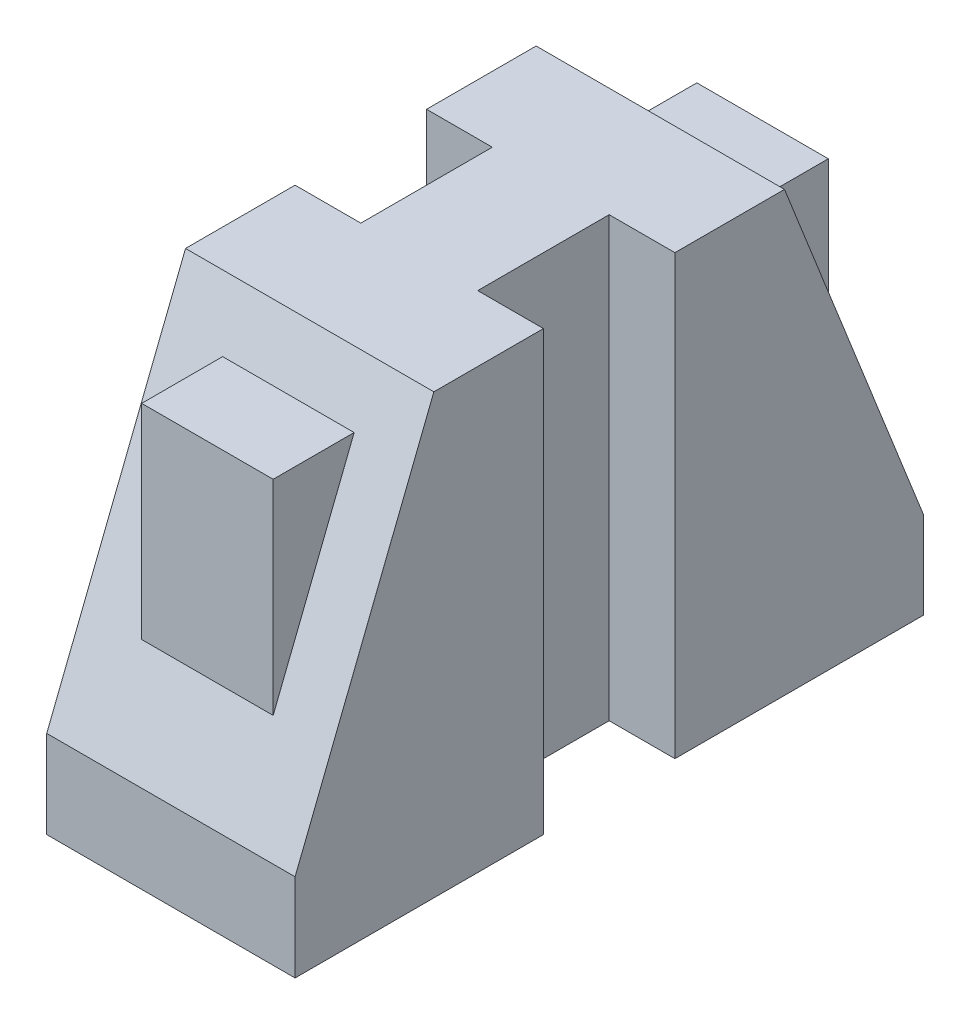
ISO-10303-21;
HEADER;
FILE_DESCRIPTION(('STEP AP214'),'2;1');
FILE_NAME('part.step','',(''),(''),'','','');
FILE_SCHEMA(('AUTOMOTIVE_DESIGN { 1 0 10303 214 1 1 1 1 }'));
ENDSEC;
DATA;
#1=APPLICATION_CONTEXT('core data for automotive mechanical design processes');
#2=APPLICATION_PROTOCOL_DEFINITION('international standard','automotive_design',2000,#1);
#3=PRODUCT_CONTEXT('',#1,'mechanical');
#4=PRODUCT('Part','Part','',(#3));
#5=PRODUCT_RELATED_PRODUCT_CATEGORY('part','',(#4));
#6=PRODUCT_DEFINITION_FORMATION('','',#4);
#7=PRODUCT_DEFINITION_CONTEXT('part definition',#1,'design');
#8=PRODUCT_DEFINITION('design','',#6,#7);
#9=PRODUCT_DEFINITION_SHAPE('','',#8);
#10=(LENGTH_UNIT() NAMED_UNIT(*) SI_UNIT(.MILLI.,.METRE.));
#11=(NAMED_UNIT(*) PLANE_ANGLE_UNIT() SI_UNIT($,.RADIAN.));
#12=(NAMED_UNIT(*) SI_UNIT($,.STERADIAN.) SOLID_ANGLE_UNIT());
#13=UNCERTAINTY_MEASURE_WITH_UNIT(LENGTH_MEASURE(1.E-05),#10,'distance_accuracy_value','');
#14=(GEOMETRIC_REPRESENTATION_CONTEXT(3) GLOBAL_UNCERTAINTY_ASSIGNED_CONTEXT((#13)) GLOBAL_UNIT_ASSIGNED_CONTEXT((#10,
#11,#12)) REPRESENTATION_CONTEXT('',''));
#15=CARTESIAN_POINT('',(0.,0.,0.));
#16=DIRECTION('',(0.,0.,1.));
#17=DIRECTION('',(1.,0.,0.));
#18=AXIS2_PLACEMENT_3D('',#15,#16,#17);
#19=CARTESIAN_POINT('',(17.,0.,0.));
#20=DIRECTION('',(-1.,0.,0.));
#21=DIRECTION('',(0.,0.,1.));
#22=AXIS2_PLACEMENT_3D('',#19,#20,#21);
#23=PLANE('',#22);
#24=DIRECTION('',(0.,0.,-1.));
#25=VECTOR('',#24,1.);
#26=CARTESIAN_POINT('',(17.,0.,-43.));
#27=LINE('',#26,#25);
#28=CARTESIAN_POINT('',(17.,0.,43.));
#29=VERTEX_POINT('',#28);
#30=CARTESIAN_POINT('',(17.,0.,9.));
#31=VERTEX_POINT('',#30);
#32=EDGE_CURVE('E293',#29,#31,#27,.T.);
#33=ORIENTED_EDGE('',*,*,#32,.T.);
#34=DIRECTION('',(0.,1.,0.));
#35=VECTOR('',#34,1.);
#36=CARTESIAN_POINT('',(17.,0.,9.));
#37=LINE('',#36,#35);
#38=CARTESIAN_POINT('',(17.,60.,9.));
#39=VERTEX_POINT('',#38);
#40=EDGE_CURVE('E247',#31,#39,#37,.T.);
#41=ORIENTED_EDGE('',*,*,#40,.T.);
#42=DIRECTION('',(0.,0.,1.));
#43=VECTOR('',#42,1.);
#44=CARTESIAN_POINT('',(17.,60.,24.));
#45=LINE('',#44,#43);
#46=CARTESIAN_POINT('',(17.,60.,24.));
#47=VERTEX_POINT('',#46);
#48=EDGE_CURVE('E283',#39,#47,#45,.T.);
#49=ORIENTED_EDGE('',*,*,#48,.T.);
#50=DIRECTION('',(0.,-0.929806613071272,0.368048451007378));
#51=VECTOR('',#50,1.);
#52=CARTESIAN_POINT('',(17.,12.,43.));
#53=LINE('',#52,#51);
#54=CARTESIAN_POINT('',(17.,12.,43.));
#55=VERTEX_POINT('',#54);
#56=EDGE_CURVE('E288',#47,#55,#53,.T.);
#57=ORIENTED_EDGE('',*,*,#56,.T.);
#58=DIRECTION('',(0.,-1.,0.));
#59=VECTOR('',#58,1.);
#60=CARTESIAN_POINT('',(17.,0.,43.));
#61=LINE('',#60,#59);
#62=EDGE_CURVE('E290',#55,#29,#61,.T.);
#63=ORIENTED_EDGE('',*,*,#62,.T.);
#64=EDGE_LOOP('',(#33,#41,#49,#57,#63));
#65=FACE_BOUND('',#64,.T.);
#66=ADVANCED_FACE('F39',(#65),#23,.F.);
#67=CARTESIAN_POINT('',(-17.,0.,0.));
#68=DIRECTION('',(-1.,0.,0.));
#69=DIRECTION('',(0.,0.,1.));
#70=AXIS2_PLACEMENT_3D('',#67,#68,#69);
#71=PLANE('',#70);
#72=DIRECTION('',(0.,1.,0.));
#73=VECTOR('',#72,1.);
#74=CARTESIAN_POINT('',(-17.,0.,-9.));
#75=LINE('',#74,#73);
#76=CARTESIAN_POINT('',(-17.,0.,-9.));
#77=VERTEX_POINT('',#76);
#78=CARTESIAN_POINT('',(-17.,60.,-9.));
#79=VERTEX_POINT('',#78);
#80=EDGE_CURVE('E243',#77,#79,#75,.T.);
#81=ORIENTED_EDGE('',*,*,#80,.T.);
#82=DIRECTION('',(0.,0.,1.));
#83=VECTOR('',#82,1.);
#84=CARTESIAN_POINT('',(-17.,60.,24.));
#85=LINE('',#84,#83);
#86=CARTESIAN_POINT('',(-17.,60.,-24.));
#87=VERTEX_POINT('',#86);
#88=EDGE_CURVE('E302',#87,#79,#85,.T.);
#89=ORIENTED_EDGE('',*,*,#88,.F.);
#90=DIRECTION('',(0.,0.929806613071272,0.368048451007378));
#91=VECTOR('',#90,1.);
#92=CARTESIAN_POINT('',(-17.,12.,-43.));
#93=LINE('',#92,#91);
#94=CARTESIAN_POINT('',(-17.,12.,-43.));
#95=VERTEX_POINT('',#94);
#96=EDGE_CURVE('E250',#95,#87,#93,.T.);
#97=ORIENTED_EDGE('',*,*,#96,.F.);
#98=DIRECTION('',(0.,1.,0.));
#99=VECTOR('',#98,1.);
#100=CARTESIAN_POINT('',(-17.,0.,-43.));
#101=LINE('',#100,#99);
#102=CARTESIAN_POINT('',(-17.,0.,-43.));
#103=VERTEX_POINT('',#102);
#104=EDGE_CURVE('E284',#103,#95,#101,.T.);
#105=ORIENTED_EDGE('',*,*,#104,.F.);
#106=DIRECTION('',(0.,0.,-1.));
#107=VECTOR('',#106,1.);
#108=CARTESIAN_POINT('',(-17.,0.,-43.));
#109=LINE('',#108,#107);
#110=EDGE_CURVE('E309',#77,#103,#109,.T.);
#111=ORIENTED_EDGE('',*,*,#110,.F.);
#112=EDGE_LOOP('',(#81,#89,#97,#105,#111));
#113=FACE_BOUND('',#112,.T.);
#114=ADVANCED_FACE('F371',(#113),#71,.T.);
#115=CARTESIAN_POINT('',(17.,12.,-43.));
#116=DIRECTION('',(0.,-0.368048451007378,0.929806613071272));
#117=DIRECTION('',(0.,-0.929806613071272,-0.368048451007378));
#118=AXIS2_PLACEMENT_3D('',#115,#116,#117);
#119=PLANE('',#118);
#120=DIRECTION('',(-1.,0.,0.));
#121=VECTOR('',#120,1.);
#122=CARTESIAN_POINT('',(9.,52.6315789473684,-26.9166666666667));
#123=LINE('',#122,#121);
#124=CARTESIAN_POINT('',(9.,52.6315789473684,-26.9166666666667));
#125=VERTEX_POINT('',#124);
#126=CARTESIAN_POINT('',(-9.,52.6315789473684,-26.9166666666667));
#127=VERTEX_POINT('',#126);
#128=EDGE_CURVE('E188',#125,#127,#123,.T.);
#129=ORIENTED_EDGE('',*,*,#128,.T.);
#130=DIRECTION('',(0.,-0.929806613071272,-0.368048451007378));
#131=VECTOR('',#130,1.);
#132=CARTESIAN_POINT('',(-9.,52.6315789473684,-26.9166666666667));
#133=LINE('',#132,#131);
#134=CARTESIAN_POINT('',(-9.,24.6315789473684,-38.));
#135=VERTEX_POINT('',#134);
#136=EDGE_CURVE('E201',#127,#135,#133,.T.);
#137=ORIENTED_EDGE('',*,*,#136,.T.);
#138=DIRECTION('',(-1.,0.,0.));
#139=VECTOR('',#138,1.);
#140=CARTESIAN_POINT('',(9.,24.6315789473684,-38.));
#141=LINE('',#140,#139);
#142=CARTESIAN_POINT('',(9.,24.6315789473684,-38.));
#143=VERTEX_POINT('',#142);
#144=EDGE_CURVE('E192',#143,#135,#141,.T.);
#145=ORIENTED_EDGE('',*,*,#144,.F.);
#146=DIRECTION('',(0.,-0.929806613071272,-0.368048451007378));
#147=VECTOR('',#146,1.);
#148=CARTESIAN_POINT('',(9.,52.6315789473684,-26.9166666666667));
#149=LINE('',#148,#147);
#150=EDGE_CURVE('E181',#125,#143,#149,.T.);
#151=ORIENTED_EDGE('',*,*,#150,.F.);
#152=EDGE_LOOP('',(#129,#137,#145,#151));
#153=FACE_BOUND('',#152,.T.);
#154=ORIENTED_EDGE('',*,*,#96,.T.);
#155=DIRECTION('',(-1.,0.,0.));
#156=VECTOR('',#155,1.);
#157=CARTESIAN_POINT('',(17.,60.,-24.));
#158=LINE('',#157,#156);
#159=CARTESIAN_POINT('',(17.,60.,-24.));
#160=VERTEX_POINT('',#159);
#161=EDGE_CURVE('E11',#160,#87,#158,.T.);
#162=ORIENTED_EDGE('',*,*,#161,.F.);
#163=DIRECTION('',(0.,0.929806613071272,0.368048451007378));
#164=VECTOR('',#163,1.);
#165=CARTESIAN_POINT('',(17.,12.,-43.));
#166=LINE('',#165,#164);
#167=CARTESIAN_POINT('',(17.,12.,-43.));
#168=VERTEX_POINT('',#167);
#169=EDGE_CURVE('E280',#168,#160,#166,.T.);
#170=ORIENTED_EDGE('',*,*,#169,.F.);
#171=DIRECTION('',(-1.,0.,0.));
#172=VECTOR('',#171,1.);
#173=CARTESIAN_POINT('',(17.,12.,-43.));
#174=LINE('',#173,#172);
#175=EDGE_CURVE('E298',#168,#95,#174,.T.);
#176=ORIENTED_EDGE('',*,*,#175,.T.);
#177=EDGE_LOOP('',(#154,#162,#170,#176));
#178=FACE_BOUND('',#177,.T.);
#179=ADVANCED_FACE('F41',(#153,#178),#119,.F.);
#180=CARTESIAN_POINT('',(17.,60.,24.));
#181=DIRECTION('',(0.,-1.,0.));
#182=DIRECTION('',(0.,0.,-1.));
#183=AXIS2_PLACEMENT_3D('',#180,#181,#182);
#184=PLANE('',#183);
#185=ORIENTED_EDGE('',*,*,#48,.F.);
#186=DIRECTION('',(1.,0.,0.));
#187=VECTOR('',#186,1.);
#188=CARTESIAN_POINT('',(17.,60.,9.));
#189=LINE('',#188,#187);
#190=CARTESIAN_POINT('',(8.,60.,9.));
#191=VERTEX_POINT('',#190);
#192=EDGE_CURVE('E232',#191,#39,#189,.T.);
#193=ORIENTED_EDGE('',*,*,#192,.F.);
#194=DIRECTION('',(0.,0.,1.));
#195=VECTOR('',#194,1.);
#196=CARTESIAN_POINT('',(8.,60.,-9.));
#197=LINE('',#196,#195);
#198=CARTESIAN_POINT('',(8.,60.,-9.));
#199=VERTEX_POINT('',#198);
#200=EDGE_CURVE('E242',#199,#191,#197,.T.);
#201=ORIENTED_EDGE('',*,*,#200,.F.);
#202=DIRECTION('',(-1.,0.,0.));
#203=VECTOR('',#202,1.);
#204=CARTESIAN_POINT('',(17.,60.,-9.));
#205=LINE('',#204,#203);
#206=CARTESIAN_POINT('',(17.,60.,-9.));
#207=VERTEX_POINT('',#206);
#208=EDGE_CURVE('E239',#207,#199,#205,.T.);
#209=ORIENTED_EDGE('',*,*,#208,.F.);
#210=EDGE_CURVE('E285',#160,#207,#45,.T.);
#211=ORIENTED_EDGE('',*,*,#210,.F.);
#212=ORIENTED_EDGE('',*,*,#161,.T.);
#213=ORIENTED_EDGE('',*,*,#88,.T.);
#214=DIRECTION('',(-1.,0.,0.));
#215=VECTOR('',#214,1.);
#216=CARTESIAN_POINT('',(-17.,60.,-9.));
#217=LINE('',#216,#215);
#218=CARTESIAN_POINT('',(-8.,60.,-9.));
#219=VERTEX_POINT('',#218);
#220=EDGE_CURVE('E260',#219,#79,#217,.T.);
#221=ORIENTED_EDGE('',*,*,#220,.F.);
#222=DIRECTION('',(0.,0.,-1.));
#223=VECTOR('',#222,1.);
#224=CARTESIAN_POINT('',(-8.,60.,-9.));
#225=LINE('',#224,#223);
#226=CARTESIAN_POINT('',(-8.,60.,9.));
#227=VERTEX_POINT('',#226);
#228=EDGE_CURVE('E269',#227,#219,#225,.T.);
#229=ORIENTED_EDGE('',*,*,#228,.F.);
#230=DIRECTION('',(1.,0.,0.));
#231=VECTOR('',#230,1.);
#232=CARTESIAN_POINT('',(-17.,60.,9.));
#233=LINE('',#232,#231);
#234=CARTESIAN_POINT('',(-17.,60.,9.));
#235=VERTEX_POINT('',#234);
#236=EDGE_CURVE('E227',#235,#227,#233,.T.);
#237=ORIENTED_EDGE('',*,*,#236,.F.);
#238=CARTESIAN_POINT('',(-17.,60.,24.));
#239=VERTEX_POINT('',#238);
#240=EDGE_CURVE('E301',#235,#239,#85,.T.);
#241=ORIENTED_EDGE('',*,*,#240,.T.);
#242=DIRECTION('',(-1.,0.,0.));
#243=VECTOR('',#242,1.);
#244=CARTESIAN_POINT('',(17.,60.,24.));
#245=LINE('',#244,#243);
#246=EDGE_CURVE('E47',#47,#239,#245,.T.);
#247=ORIENTED_EDGE('',*,*,#246,.F.);
#248=EDGE_LOOP('',(#185,#193,#201,#209,#211,#212,#213,#221,#229,#237,#241,#247));
#249=FACE_BOUND('',#248,.T.);
#250=ADVANCED_FACE('F349',(#249),#184,.F.);
#251=CARTESIAN_POINT('',(17.,12.,43.));
#252=DIRECTION('',(0.,-0.368048451007378,-0.929806613071272));
#253=DIRECTION('',(0.,0.929806613071272,-0.368048451007378));
#254=AXIS2_PLACEMENT_3D('',#251,#252,#253);
#255=PLANE('',#254);
#256=DIRECTION('',(-1.,0.,0.));
#257=VECTOR('',#256,1.);
#258=CARTESIAN_POINT('',(9.,24.6315789473684,38.));
#259=LINE('',#258,#257);
#260=CARTESIAN_POINT('',(9.,24.6315789473684,38.));
#261=VERTEX_POINT('',#260);
#262=CARTESIAN_POINT('',(-9.,24.6315789473684,38.));
#263=VERTEX_POINT('',#262);
#264=EDGE_CURVE('E214',#261,#263,#259,.T.);
#265=ORIENTED_EDGE('',*,*,#264,.T.);
#266=DIRECTION('',(0.,0.929806613071272,-0.368048451007378));
#267=VECTOR('',#266,1.);
#268=CARTESIAN_POINT('',(-9.,52.6315789473684,26.9166666666667));
#269=LINE('',#268,#267);
#270=CARTESIAN_POINT('',(-9.,52.6315789473684,26.9166666666667));
#271=VERTEX_POINT('',#270);
#272=EDGE_CURVE('E62',#263,#271,#269,.T.);
#273=ORIENTED_EDGE('',*,*,#272,.T.);
#274=DIRECTION('',(-1.,0.,0.));
#275=VECTOR('',#274,1.);
#276=CARTESIAN_POINT('',(9.,52.6315789473684,26.9166666666667));
#277=LINE('',#276,#275);
#278=CARTESIAN_POINT('',(9.,52.6315789473684,26.9166666666667));
#279=VERTEX_POINT('',#278);
#280=EDGE_CURVE('E224',#279,#271,#277,.T.);
#281=ORIENTED_EDGE('',*,*,#280,.F.);
#282=DIRECTION('',(0.,0.929806613071272,-0.368048451007378));
#283=VECTOR('',#282,1.);
#284=CARTESIAN_POINT('',(9.,52.6315789473684,26.9166666666667));
#285=LINE('',#284,#283);
#286=EDGE_CURVE('E206',#261,#279,#285,.T.);
#287=ORIENTED_EDGE('',*,*,#286,.F.);
#288=EDGE_LOOP('',(#265,#273,#281,#287));
#289=FACE_BOUND('',#288,.T.);
#290=DIRECTION('',(0.,-0.929806613071272,0.368048451007378));
#291=VECTOR('',#290,1.);
#292=CARTESIAN_POINT('',(-17.,12.,43.));
#293=LINE('',#292,#291);
#294=CARTESIAN_POINT('',(-17.,12.,43.));
#295=VERTEX_POINT('',#294);
#296=EDGE_CURVE('E305',#239,#295,#293,.T.);
#297=ORIENTED_EDGE('',*,*,#296,.T.);
#298=DIRECTION('',(-1.,0.,0.));
#299=VECTOR('',#298,1.);
#300=CARTESIAN_POINT('',(17.,12.,43.));
#301=LINE('',#300,#299);
#302=EDGE_CURVE('E322',#55,#295,#301,.T.);
#303=ORIENTED_EDGE('',*,*,#302,.F.);
#304=ORIENTED_EDGE('',*,*,#56,.F.);
#305=ORIENTED_EDGE('',*,*,#246,.T.);
#306=EDGE_LOOP('',(#297,#303,#304,#305));
#307=FACE_BOUND('',#306,.T.);
#308=ADVANCED_FACE('F329',(#289,#307),#255,.F.);
#309=CARTESIAN_POINT('',(17.,0.,43.));
#310=DIRECTION('',(0.,0.,-1.));
#311=DIRECTION('',(-1.,0.,0.));
#312=AXIS2_PLACEMENT_3D('',#309,#310,#311);
#313=PLANE('',#312);
#314=DIRECTION('',(0.,-1.,0.));
#315=VECTOR('',#314,1.);
#316=CARTESIAN_POINT('',(-17.,0.,43.));
#317=LINE('',#316,#315);
#318=CARTESIAN_POINT('',(-17.,0.,43.));
#319=VERTEX_POINT('',#318);
#320=EDGE_CURVE('E307',#295,#319,#317,.T.);
#321=ORIENTED_EDGE('',*,*,#320,.T.);
#322=DIRECTION('',(-1.,0.,0.));
#323=VECTOR('',#322,1.);
#324=CARTESIAN_POINT('',(17.,0.,43.));
#325=LINE('',#324,#323);
#326=EDGE_CURVE('E319',#29,#319,#325,.T.);
#327=ORIENTED_EDGE('',*,*,#326,.F.);
#328=ORIENTED_EDGE('',*,*,#62,.F.);
#329=ORIENTED_EDGE('',*,*,#302,.T.);
#330=EDGE_LOOP('',(#321,#327,#328,#329));
#331=FACE_BOUND('',#330,.T.);
#332=ADVANCED_FACE('F341',(#331),#313,.F.);
#333=CARTESIAN_POINT('',(17.,0.,-43.));
#334=DIRECTION('',(0.,1.,0.));
#335=DIRECTION('',(0.,0.,1.));
#336=AXIS2_PLACEMENT_3D('',#333,#334,#335);
#337=PLANE('',#336);
#338=DIRECTION('',(0.,0.,1.));
#339=VECTOR('',#338,1.);
#340=CARTESIAN_POINT('',(8.,0.,-9.));
#341=LINE('',#340,#339);
#342=CARTESIAN_POINT('',(8.,0.,-9.));
#343=VERTEX_POINT('',#342);
#344=CARTESIAN_POINT('',(8.,0.,9.));
#345=VERTEX_POINT('',#344);
#346=EDGE_CURVE('E231',#343,#345,#341,.T.);
#347=ORIENTED_EDGE('',*,*,#346,.T.);
#348=DIRECTION('',(1.,0.,0.));
#349=VECTOR('',#348,1.);
#350=CARTESIAN_POINT('',(17.,0.,9.));
#351=LINE('',#350,#349);
#352=EDGE_CURVE('E235',#345,#31,#351,.T.);
#353=ORIENTED_EDGE('',*,*,#352,.T.);
#354=ORIENTED_EDGE('',*,*,#32,.F.);
#355=ORIENTED_EDGE('',*,*,#326,.T.);
#356=CARTESIAN_POINT('',(-17.,0.,9.));
#357=VERTEX_POINT('',#356);
#358=EDGE_CURVE('E310',#319,#357,#109,.T.);
#359=ORIENTED_EDGE('',*,*,#358,.T.);
#360=DIRECTION('',(1.,0.,0.));
#361=VECTOR('',#360,1.);
#362=CARTESIAN_POINT('',(-17.,0.,9.));
#363=LINE('',#362,#361);
#364=CARTESIAN_POINT('',(-8.,0.,9.));
#365=VERTEX_POINT('',#364);
#366=EDGE_CURVE('E256',#357,#365,#363,.T.);
#367=ORIENTED_EDGE('',*,*,#366,.T.);
#368=DIRECTION('',(0.,0.,-1.));
#369=VECTOR('',#368,1.);
#370=CARTESIAN_POINT('',(-8.,0.,-9.));
#371=LINE('',#370,#369);
#372=CARTESIAN_POINT('',(-8.,0.,-9.));
#373=VERTEX_POINT('',#372);
#374=EDGE_CURVE('E259',#365,#373,#371,.T.);
#375=ORIENTED_EDGE('',*,*,#374,.T.);
#376=DIRECTION('',(-1.,0.,0.));
#377=VECTOR('',#376,1.);
#378=CARTESIAN_POINT('',(-17.,0.,-9.));
#379=LINE('',#378,#377);
#380=EDGE_CURVE('E263',#373,#77,#379,.T.);
#381=ORIENTED_EDGE('',*,*,#380,.T.);
#382=ORIENTED_EDGE('',*,*,#110,.T.);
#383=DIRECTION('',(-1.,0.,0.));
#384=VECTOR('',#383,1.);
#385=CARTESIAN_POINT('',(17.,0.,-43.));
#386=LINE('',#385,#384);
#387=CARTESIAN_POINT('',(17.,0.,-43.));
#388=VERTEX_POINT('',#387);
#389=EDGE_CURVE('E316',#388,#103,#386,.T.);
#390=ORIENTED_EDGE('',*,*,#389,.F.);
#391=CARTESIAN_POINT('',(17.,0.,-9.));
#392=VERTEX_POINT('',#391);
#393=EDGE_CURVE('E292',#392,#388,#27,.T.);
#394=ORIENTED_EDGE('',*,*,#393,.F.);
#395=DIRECTION('',(-1.,0.,0.));
#396=VECTOR('',#395,1.);
#397=CARTESIAN_POINT('',(17.,0.,-9.));
#398=LINE('',#397,#396);
#399=EDGE_CURVE('E228',#392,#343,#398,.T.);
#400=ORIENTED_EDGE('',*,*,#399,.T.);
#401=EDGE_LOOP('',(#347,#353,#354,#355,#359,#367,#375,#381,#382,#390,#394,#400));
#402=FACE_BOUND('',#401,.T.);
#403=ADVANCED_FACE('F345',(#402),#337,.F.);
#404=CARTESIAN_POINT('',(17.,0.,-43.));
#405=DIRECTION('',(0.,0.,1.));
#406=DIRECTION('',(1.,0.,0.));
#407=AXIS2_PLACEMENT_3D('',#404,#405,#406);
#408=PLANE('',#407);
#409=ORIENTED_EDGE('',*,*,#104,.T.);
#410=ORIENTED_EDGE('',*,*,#175,.F.);
#411=DIRECTION('',(0.,1.,0.));
#412=VECTOR('',#411,1.);
#413=CARTESIAN_POINT('',(17.,0.,-43.));
#414=LINE('',#413,#412);
#415=EDGE_CURVE('E296',#388,#168,#414,.T.);
#416=ORIENTED_EDGE('',*,*,#415,.F.);
#417=ORIENTED_EDGE('',*,*,#389,.T.);
#418=EDGE_LOOP('',(#409,#410,#416,#417));
#419=FACE_BOUND('',#418,.T.);
#420=ADVANCED_FACE('F400',(#419),#408,.F.);
#421=ORIENTED_EDGE('',*,*,#210,.T.);
#422=DIRECTION('',(0.,1.,0.));
#423=VECTOR('',#422,1.);
#424=CARTESIAN_POINT('',(17.,0.,-9.));
#425=LINE('',#424,#423);
#426=EDGE_CURVE('E238',#392,#207,#425,.T.);
#427=ORIENTED_EDGE('',*,*,#426,.F.);
#428=ORIENTED_EDGE('',*,*,#393,.T.);
#429=ORIENTED_EDGE('',*,*,#415,.T.);
#430=ORIENTED_EDGE('',*,*,#169,.T.);
#431=EDGE_LOOP('',(#421,#427,#428,#429,#430));
#432=FACE_BOUND('',#431,.T.);
#433=ADVANCED_FACE('F361',(#432),#23,.F.);
#434=DIRECTION('',(0.,1.,0.));
#435=VECTOR('',#434,1.);
#436=CARTESIAN_POINT('',(-17.,0.,9.));
#437=LINE('',#436,#435);
#438=EDGE_CURVE('E266',#357,#235,#437,.T.);
#439=ORIENTED_EDGE('',*,*,#438,.F.);
#440=ORIENTED_EDGE('',*,*,#358,.F.);
#441=ORIENTED_EDGE('',*,*,#320,.F.);
#442=ORIENTED_EDGE('',*,*,#296,.F.);
#443=ORIENTED_EDGE('',*,*,#240,.F.);
#444=EDGE_LOOP('',(#439,#440,#441,#442,#443));
#445=FACE_BOUND('',#444,.T.);
#446=ADVANCED_FACE('F337',(#445),#71,.T.);
#447=CARTESIAN_POINT('',(-17.,0.,-9.));
#448=DIRECTION('',(0.,0.,-1.));
#449=DIRECTION('',(-1.,0.,0.));
#450=AXIS2_PLACEMENT_3D('',#447,#448,#449);
#451=PLANE('',#450);
#452=ORIENTED_EDGE('',*,*,#220,.T.);
#453=ORIENTED_EDGE('',*,*,#80,.F.);
#454=ORIENTED_EDGE('',*,*,#380,.F.);
#455=DIRECTION('',(0.,1.,0.));
#456=VECTOR('',#455,1.);
#457=CARTESIAN_POINT('',(-8.,0.,-9.));
#458=LINE('',#457,#456);
#459=EDGE_CURVE('E275',#373,#219,#458,.T.);
#460=ORIENTED_EDGE('',*,*,#459,.T.);
#461=EDGE_LOOP('',(#452,#453,#454,#460));
#462=FACE_BOUND('',#461,.T.);
#463=ADVANCED_FACE('F376',(#462),#451,.F.);
#464=CARTESIAN_POINT('',(-8.,0.,-9.));
#465=DIRECTION('',(1.,0.,0.));
#466=DIRECTION('',(0.,0.,-1.));
#467=AXIS2_PLACEMENT_3D('',#464,#465,#466);
#468=PLANE('',#467);
#469=ORIENTED_EDGE('',*,*,#228,.T.);
#470=ORIENTED_EDGE('',*,*,#459,.F.);
#471=ORIENTED_EDGE('',*,*,#374,.F.);
#472=DIRECTION('',(0.,1.,0.));
#473=VECTOR('',#472,1.);
#474=CARTESIAN_POINT('',(-8.,0.,9.));
#475=LINE('',#474,#473);
#476=EDGE_CURVE('E277',#365,#227,#475,.T.);
#477=ORIENTED_EDGE('',*,*,#476,.T.);
#478=EDGE_LOOP('',(#469,#470,#471,#477));
#479=FACE_BOUND('',#478,.T.);
#480=ADVANCED_FACE('F380',(#479),#468,.F.);
#481=CARTESIAN_POINT('',(-17.,0.,9.));
#482=DIRECTION('',(0.,0.,1.));
#483=DIRECTION('',(1.,0.,0.));
#484=AXIS2_PLACEMENT_3D('',#481,#482,#483);
#485=PLANE('',#484);
#486=ORIENTED_EDGE('',*,*,#236,.T.);
#487=ORIENTED_EDGE('',*,*,#476,.F.);
#488=ORIENTED_EDGE('',*,*,#366,.F.);
#489=ORIENTED_EDGE('',*,*,#438,.T.);
#490=EDGE_LOOP('',(#486,#487,#488,#489));
#491=FACE_BOUND('',#490,.T.);
#492=ADVANCED_FACE('F383',(#491),#485,.F.);
#493=CARTESIAN_POINT('',(17.,0.,9.));
#494=DIRECTION('',(0.,0.,1.));
#495=DIRECTION('',(1.,0.,0.));
#496=AXIS2_PLACEMENT_3D('',#493,#494,#495);
#497=PLANE('',#496);
#498=ORIENTED_EDGE('',*,*,#192,.T.);
#499=ORIENTED_EDGE('',*,*,#40,.F.);
#500=ORIENTED_EDGE('',*,*,#352,.F.);
#501=DIRECTION('',(0.,1.,0.));
#502=VECTOR('',#501,1.);
#503=CARTESIAN_POINT('',(8.,0.,9.));
#504=LINE('',#503,#502);
#505=EDGE_CURVE('E251',#345,#191,#504,.T.);
#506=ORIENTED_EDGE('',*,*,#505,.T.);
#507=EDGE_LOOP('',(#498,#499,#500,#506));
#508=FACE_BOUND('',#507,.T.);
#509=ADVANCED_FACE('F353',(#508),#497,.F.);
#510=CARTESIAN_POINT('',(8.,0.,-9.));
#511=DIRECTION('',(-1.,0.,0.));
#512=DIRECTION('',(0.,0.,1.));
#513=AXIS2_PLACEMENT_3D('',#510,#511,#512);
#514=PLANE('',#513);
#515=ORIENTED_EDGE('',*,*,#200,.T.);
#516=ORIENTED_EDGE('',*,*,#505,.F.);
#517=ORIENTED_EDGE('',*,*,#346,.F.);
#518=DIRECTION('',(0.,1.,0.));
#519=VECTOR('',#518,1.);
#520=CARTESIAN_POINT('',(8.,0.,-9.));
#521=LINE('',#520,#519);
#522=EDGE_CURVE('E253',#343,#199,#521,.T.);
#523=ORIENTED_EDGE('',*,*,#522,.T.);
#524=EDGE_LOOP('',(#515,#516,#517,#523));
#525=FACE_BOUND('',#524,.T.);
#526=ADVANCED_FACE('F356',(#525),#514,.F.);
#527=CARTESIAN_POINT('',(17.,0.,-9.));
#528=DIRECTION('',(0.,0.,-1.));
#529=DIRECTION('',(-1.,0.,0.));
#530=AXIS2_PLACEMENT_3D('',#527,#528,#529);
#531=PLANE('',#530);
#532=ORIENTED_EDGE('',*,*,#208,.T.);
#533=ORIENTED_EDGE('',*,*,#522,.F.);
#534=ORIENTED_EDGE('',*,*,#399,.F.);
#535=ORIENTED_EDGE('',*,*,#426,.T.);
#536=EDGE_LOOP('',(#532,#533,#534,#535));
#537=FACE_BOUND('',#536,.T.);
#538=ADVANCED_FACE('F358',(#537),#531,.F.);
#539=CARTESIAN_POINT('',(9.,52.6315789473684,38.));
#540=DIRECTION('',(0.,-1.,0.));
#541=DIRECTION('',(0.,0.,-1.));
#542=AXIS2_PLACEMENT_3D('',#539,#540,#541);
#543=PLANE('',#542);
#544=DIRECTION('',(0.,0.,1.));
#545=VECTOR('',#544,1.);
#546=CARTESIAN_POINT('',(-9.,52.6315789473684,38.));
#547=LINE('',#546,#545);
#548=CARTESIAN_POINT('',(-9.,52.6315789473684,38.));
#549=VERTEX_POINT('',#548);
#550=EDGE_CURVE('E216',#271,#549,#547,.T.);
#551=ORIENTED_EDGE('',*,*,#550,.T.);
#552=DIRECTION('',(-1.,0.,0.));
#553=VECTOR('',#552,1.);
#554=CARTESIAN_POINT('',(9.,52.6315789473684,38.));
#555=LINE('',#554,#553);
#556=CARTESIAN_POINT('',(9.,52.6315789473684,38.));
#557=VERTEX_POINT('',#556);
#558=EDGE_CURVE('E221',#557,#549,#555,.T.);
#559=ORIENTED_EDGE('',*,*,#558,.F.);
#560=DIRECTION('',(0.,0.,1.));
#561=VECTOR('',#560,1.);
#562=CARTESIAN_POINT('',(9.,52.6315789473684,38.));
#563=LINE('',#562,#561);
#564=EDGE_CURVE('E209',#279,#557,#563,.T.);
#565=ORIENTED_EDGE('',*,*,#564,.F.);
#566=ORIENTED_EDGE('',*,*,#280,.T.);
#567=EDGE_LOOP('',(#551,#559,#565,#566));
#568=FACE_BOUND('',#567,.T.);
#569=ADVANCED_FACE('F433',(#568),#543,.F.);
#570=CARTESIAN_POINT('',(9.,24.6315789473684,38.));
#571=DIRECTION('',(0.,0.,-1.));
#572=DIRECTION('',(-1.,0.,0.));
#573=AXIS2_PLACEMENT_3D('',#570,#571,#572);
#574=PLANE('',#573);
#575=DIRECTION('',(0.,-1.,0.));
#576=VECTOR('',#575,1.);
#577=CARTESIAN_POINT('',(-9.,24.6315789473684,38.));
#578=LINE('',#577,#576);
#579=EDGE_CURVE('E210',#549,#263,#578,.T.);
#580=ORIENTED_EDGE('',*,*,#579,.T.);
#581=ORIENTED_EDGE('',*,*,#264,.F.);
#582=DIRECTION('',(0.,-1.,0.));
#583=VECTOR('',#582,1.);
#584=CARTESIAN_POINT('',(9.,24.6315789473684,38.));
#585=LINE('',#584,#583);
#586=EDGE_CURVE('E212',#557,#261,#585,.T.);
#587=ORIENTED_EDGE('',*,*,#586,.F.);
#588=ORIENTED_EDGE('',*,*,#558,.T.);
#589=EDGE_LOOP('',(#580,#581,#587,#588));
#590=FACE_BOUND('',#589,.T.);
#591=ADVANCED_FACE('F437',(#590),#574,.F.);
#592=CARTESIAN_POINT('',(9.,0.,0.));
#593=DIRECTION('',(1.,0.,0.));
#594=DIRECTION('',(0.,0.,-1.));
#595=AXIS2_PLACEMENT_3D('',#592,#593,#594);
#596=PLANE('',#595);
#597=ORIENTED_EDGE('',*,*,#286,.T.);
#598=ORIENTED_EDGE('',*,*,#564,.T.);
#599=ORIENTED_EDGE('',*,*,#586,.T.);
#600=EDGE_LOOP('',(#597,#598,#599));
#601=FACE_BOUND('',#600,.T.);
#602=ADVANCED_FACE('F445',(#601),#596,.T.);
#603=CARTESIAN_POINT('',(-9.,0.,0.));
#604=DIRECTION('',(1.,0.,0.));
#605=DIRECTION('',(0.,0.,-1.));
#606=AXIS2_PLACEMENT_3D('',#603,#604,#605);
#607=PLANE('',#606);
#608=ORIENTED_EDGE('',*,*,#272,.F.);
#609=ORIENTED_EDGE('',*,*,#579,.F.);
#610=ORIENTED_EDGE('',*,*,#550,.F.);
#611=EDGE_LOOP('',(#608,#609,#610));
#612=FACE_BOUND('',#611,.T.);
#613=ADVANCED_FACE('F453',(#612),#607,.F.);
#614=CARTESIAN_POINT('',(9.,52.6315789473684,-38.));
#615=DIRECTION('',(0.,-1.,0.));
#616=DIRECTION('',(0.,0.,-1.));
#617=AXIS2_PLACEMENT_3D('',#614,#615,#616);
#618=PLANE('',#617);
#619=DIRECTION('',(0.,0.,1.));
#620=VECTOR('',#619,1.);
#621=CARTESIAN_POINT('',(-9.,52.6315789473684,-38.));
#622=LINE('',#621,#620);
#623=CARTESIAN_POINT('',(-9.,52.6315789473684,-38.));
#624=VERTEX_POINT('',#623);
#625=EDGE_CURVE('E54',#624,#127,#622,.T.);
#626=ORIENTED_EDGE('',*,*,#625,.T.);
#627=ORIENTED_EDGE('',*,*,#128,.F.);
#628=DIRECTION('',(0.,0.,1.));
#629=VECTOR('',#628,1.);
#630=CARTESIAN_POINT('',(9.,52.6315789473684,-38.));
#631=LINE('',#630,#629);
#632=CARTESIAN_POINT('',(9.,52.6315789473684,-38.));
#633=VERTEX_POINT('',#632);
#634=EDGE_CURVE('E178',#633,#125,#631,.T.);
#635=ORIENTED_EDGE('',*,*,#634,.F.);
#636=DIRECTION('',(-1.,0.,0.));
#637=VECTOR('',#636,1.);
#638=CARTESIAN_POINT('',(9.,52.6315789473684,-38.));
#639=LINE('',#638,#637);
#640=EDGE_CURVE('E197',#633,#624,#639,.T.);
#641=ORIENTED_EDGE('',*,*,#640,.T.);
#642=EDGE_LOOP('',(#626,#627,#635,#641));
#643=FACE_BOUND('',#642,.T.);
#644=ADVANCED_FACE('F189',(#643),#618,.F.);
#645=CARTESIAN_POINT('',(9.,24.6315789473684,-38.));
#646=DIRECTION('',(0.,0.,1.));
#647=DIRECTION('',(1.,0.,0.));
#648=AXIS2_PLACEMENT_3D('',#645,#646,#647);
#649=PLANE('',#648);
#650=DIRECTION('',(0.,1.,0.));
#651=VECTOR('',#650,1.);
#652=CARTESIAN_POINT('',(-9.,24.6315789473684,-38.));
#653=LINE('',#652,#651);
#654=EDGE_CURVE('E185',#135,#624,#653,.T.);
#655=ORIENTED_EDGE('',*,*,#654,.T.);
#656=ORIENTED_EDGE('',*,*,#640,.F.);
#657=DIRECTION('',(0.,1.,0.));
#658=VECTOR('',#657,1.);
#659=CARTESIAN_POINT('',(9.,24.6315789473684,-38.));
#660=LINE('',#659,#658);
#661=EDGE_CURVE('E183',#143,#633,#660,.T.);
#662=ORIENTED_EDGE('',*,*,#661,.F.);
#663=ORIENTED_EDGE('',*,*,#144,.T.);
#664=EDGE_LOOP('',(#655,#656,#662,#663));
#665=FACE_BOUND('',#664,.T.);
#666=ADVANCED_FACE('F467',(#665),#649,.F.);
#667=CARTESIAN_POINT('',(9.,0.,0.));
#668=DIRECTION('',(-1.,0.,0.));
#669=DIRECTION('',(0.,0.,1.));
#670=AXIS2_PLACEMENT_3D('',#667,#668,#669);
#671=PLANE('',#670);
#672=ORIENTED_EDGE('',*,*,#634,.T.);
#673=ORIENTED_EDGE('',*,*,#150,.T.);
#674=ORIENTED_EDGE('',*,*,#661,.T.);
#675=EDGE_LOOP('',(#672,#673,#674));
#676=FACE_BOUND('',#675,.T.);
#677=ADVANCED_FACE('F179',(#676),#671,.F.);
#678=CARTESIAN_POINT('',(-9.,0.,0.));
#679=DIRECTION('',(-1.,0.,0.));
#680=DIRECTION('',(0.,0.,1.));
#681=AXIS2_PLACEMENT_3D('',#678,#679,#680);
#682=PLANE('',#681);
#683=ORIENTED_EDGE('',*,*,#625,.F.);
#684=ORIENTED_EDGE('',*,*,#654,.F.);
#685=ORIENTED_EDGE('',*,*,#136,.F.);
#686=EDGE_LOOP('',(#683,#684,#685));
#687=FACE_BOUND('',#686,.T.);
#688=ADVANCED_FACE('F481',(#687),#682,.T.);
#689=CLOSED_SHELL('',(#66,#114,#179,#250,#308,#332,#403,#420,#433,#446,#463,#480,#492,#509,#526,
#538,#569,#591,#602,#613,#644,#666,#677,#688));
#690=MANIFOLD_SOLID_BREP('B2',#689);
#691=ADVANCED_BREP_SHAPE_REPRESENTATION('',(#18,#690),#14);
#692=SHAPE_DEFINITION_REPRESENTATION(#9,#691);
ENDSEC;
END-ISO-10303-21;
